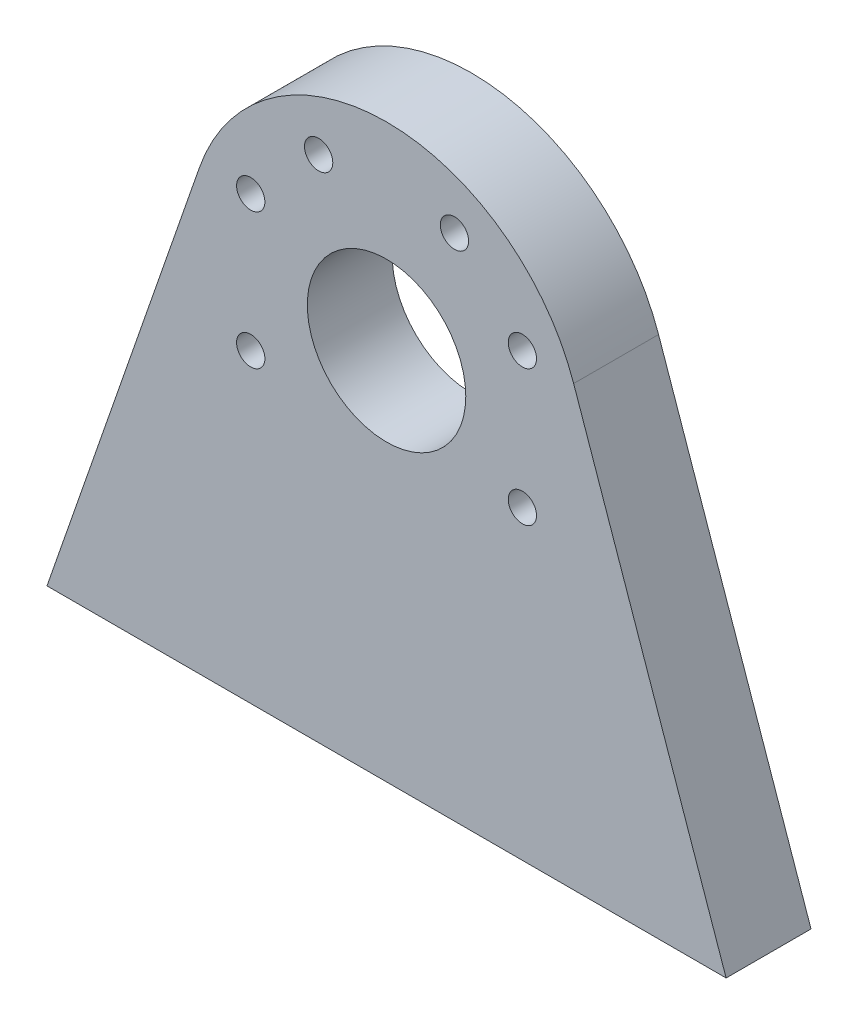
ISO-10303-21;
HEADER;
FILE_DESCRIPTION(('STEP AP214'),'2;1');
FILE_NAME('part.step','',(''),(''),'','','');
FILE_SCHEMA(('AUTOMOTIVE_DESIGN { 1 0 10303 214 1 1 1 1 }'));
ENDSEC;
DATA;
#1=APPLICATION_CONTEXT('core data for automotive mechanical design processes');
#2=APPLICATION_PROTOCOL_DEFINITION('international standard','automotive_design',2000,#1);
#3=PRODUCT_CONTEXT('',#1,'mechanical');
#4=PRODUCT('Part','Part','',(#3));
#5=PRODUCT_RELATED_PRODUCT_CATEGORY('part','',(#4));
#6=PRODUCT_DEFINITION_FORMATION('','',#4);
#7=PRODUCT_DEFINITION_CONTEXT('part definition',#1,'design');
#8=PRODUCT_DEFINITION('design','',#6,#7);
#9=PRODUCT_DEFINITION_SHAPE('','',#8);
#10=(LENGTH_UNIT() NAMED_UNIT(*) SI_UNIT(.MILLI.,.METRE.));
#11=(NAMED_UNIT(*) PLANE_ANGLE_UNIT() SI_UNIT($,.RADIAN.));
#12=(NAMED_UNIT(*) SI_UNIT($,.STERADIAN.) SOLID_ANGLE_UNIT());
#13=UNCERTAINTY_MEASURE_WITH_UNIT(LENGTH_MEASURE(1.E-05),#10,'distance_accuracy_value','');
#14=(GEOMETRIC_REPRESENTATION_CONTEXT(3) GLOBAL_UNCERTAINTY_ASSIGNED_CONTEXT((#13)) GLOBAL_UNIT_ASSIGNED_CONTEXT((#10,
#11,#12)) REPRESENTATION_CONTEXT('',''));
#15=CARTESIAN_POINT('',(0.,0.,0.));
#16=DIRECTION('',(0.,0.,1.));
#17=DIRECTION('',(1.,0.,0.));
#18=AXIS2_PLACEMENT_3D('',#15,#16,#17);
#19=CARTESIAN_POINT('',(0.,-33.,-7.5));
#20=DIRECTION('',(0.,1.,0.));
#21=DIRECTION('',(-1.,0.,0.));
#22=AXIS2_PLACEMENT_3D('',#19,#20,#21);
#23=PLANE('',#22);
#24=CARTESIAN_POINT('',(-18.,-33.,-3.75));
#25=DIRECTION('',(0.,1.,0.));
#26=DIRECTION('',(-1.,0.,0.));
#27=AXIS2_PLACEMENT_3D('',#24,#25,#26);
#28=CIRCLE('',#27,1.49999999999998);
#29=CARTESIAN_POINT('',(-19.5,-33.,-3.75));
#30=VERTEX_POINT('',#29);
#31=EDGE_CURVE('E176',#30,#30,#28,.T.);
#32=ORIENTED_EDGE('',*,*,#31,.T.);
#33=EDGE_LOOP('',(#32));
#34=FACE_BOUND('',#33,.T.);
#35=CARTESIAN_POINT('',(-5.99999999999999,-33.,-3.75));
#36=DIRECTION('',(0.,1.,0.));
#37=DIRECTION('',(-1.,0.,0.));
#38=AXIS2_PLACEMENT_3D('',#35,#36,#37);
#39=CIRCLE('',#38,1.50000000000001);
#40=CARTESIAN_POINT('',(-7.5,-33.,-3.75));
#41=VERTEX_POINT('',#40);
#42=EDGE_CURVE('E173',#41,#41,#39,.T.);
#43=ORIENTED_EDGE('',*,*,#42,.T.);
#44=EDGE_LOOP('',(#43));
#45=FACE_BOUND('',#44,.T.);
#46=CARTESIAN_POINT('',(6.00000000000001,-33.,-3.75));
#47=DIRECTION('',(0.,1.,0.));
#48=DIRECTION('',(-1.,0.,0.));
#49=AXIS2_PLACEMENT_3D('',#46,#47,#48);
#50=CIRCLE('',#49,1.50000000000001);
#51=CARTESIAN_POINT('',(4.5,-33.,-3.75));
#52=VERTEX_POINT('',#51);
#53=EDGE_CURVE('E170',#52,#52,#50,.T.);
#54=ORIENTED_EDGE('',*,*,#53,.T.);
#55=EDGE_LOOP('',(#54));
#56=FACE_BOUND('',#55,.T.);
#57=CARTESIAN_POINT('',(18.,-33.,-3.75));
#58=DIRECTION('',(0.,1.,0.));
#59=DIRECTION('',(-1.,0.,0.));
#60=AXIS2_PLACEMENT_3D('',#57,#58,#59);
#61=CIRCLE('',#60,1.50000000000001);
#62=CARTESIAN_POINT('',(16.5,-33.,-3.75));
#63=VERTEX_POINT('',#62);
#64=EDGE_CURVE('E167',#63,#63,#61,.T.);
#65=ORIENTED_EDGE('',*,*,#64,.T.);
#66=EDGE_LOOP('',(#65));
#67=FACE_BOUND('',#66,.T.);
#68=DIRECTION('',(-1.,0.,0.));
#69=VECTOR('',#68,1.);
#70=CARTESIAN_POINT('',(0.,-33.,0.));
#71=LINE('',#70,#69);
#72=CARTESIAN_POINT('',(30.,-33.,0.));
#73=VERTEX_POINT('',#72);
#74=CARTESIAN_POINT('',(-30.,-33.,0.));
#75=VERTEX_POINT('',#74);
#76=EDGE_CURVE('E132',#73,#75,#71,.T.);
#77=ORIENTED_EDGE('',*,*,#76,.T.);
#78=DIRECTION('',(0.,0.,1.));
#79=VECTOR('',#78,1.);
#80=CARTESIAN_POINT('',(-30.,-33.,-7.5));
#81=LINE('',#80,#79);
#82=CARTESIAN_POINT('',(-30.,-33.,-7.5));
#83=VERTEX_POINT('',#82);
#84=EDGE_CURVE('E160',#83,#75,#81,.T.);
#85=ORIENTED_EDGE('',*,*,#84,.F.);
#86=DIRECTION('',(-1.,0.,0.));
#87=VECTOR('',#86,1.);
#88=CARTESIAN_POINT('',(0.,-33.,-7.5));
#89=LINE('',#88,#87);
#90=CARTESIAN_POINT('',(30.,-33.,-7.5));
#91=VERTEX_POINT('',#90);
#92=EDGE_CURVE('E104',#91,#83,#89,.T.);
#93=ORIENTED_EDGE('',*,*,#92,.F.);
#94=DIRECTION('',(0.,0.,1.));
#95=VECTOR('',#94,1.);
#96=CARTESIAN_POINT('',(30.,-33.,-7.5));
#97=LINE('',#96,#95);
#98=EDGE_CURVE('E87',#91,#73,#97,.T.);
#99=ORIENTED_EDGE('',*,*,#98,.T.);
#100=EDGE_LOOP('',(#77,#85,#93,#99));
#101=FACE_BOUND('',#100,.T.);
#102=ADVANCED_FACE('F40',(#34,#45,#56,#67,#101),#23,.F.);
#103=CARTESIAN_POINT('',(-16.5295733982623,5.74658187720819,-7.5));
#104=DIRECTION('',(0.944547051329277,-0.32837610726904,0.));
#105=DIRECTION('',(0.32837610726904,0.944547051329277,0.));
#106=AXIS2_PLACEMENT_3D('',#103,#104,#105);
#107=PLANE('',#106);
#108=DIRECTION('',(0.32837610726904,0.944547051329277,0.));
#109=VECTOR('',#108,1.);
#110=CARTESIAN_POINT('',(-16.5295733982623,5.74658187720819,0.));
#111=LINE('',#110,#109);
#112=CARTESIAN_POINT('',(-16.5295733982623,5.74658187720819,0.));
#113=VERTEX_POINT('',#112);
#114=EDGE_CURVE('E81',#75,#113,#111,.T.);
#115=ORIENTED_EDGE('',*,*,#114,.T.);
#116=DIRECTION('',(0.,0.,1.));
#117=VECTOR('',#116,1.);
#118=CARTESIAN_POINT('',(-16.5295733982623,5.74658187720819,-7.5));
#119=LINE('',#118,#117);
#120=CARTESIAN_POINT('',(-16.5295733982623,5.74658187720819,-7.5));
#121=VERTEX_POINT('',#120);
#122=EDGE_CURVE('E74',#121,#113,#119,.T.);
#123=ORIENTED_EDGE('',*,*,#122,.F.);
#124=DIRECTION('',(0.32837610726904,0.944547051329277,0.));
#125=VECTOR('',#124,1.);
#126=CARTESIAN_POINT('',(-16.5295733982623,5.74658187720819,-7.5));
#127=LINE('',#126,#125);
#128=EDGE_CURVE('E58',#83,#121,#127,.T.);
#129=ORIENTED_EDGE('',*,*,#128,.F.);
#130=ORIENTED_EDGE('',*,*,#84,.T.);
#131=EDGE_LOOP('',(#115,#123,#129,#130));
#132=FACE_BOUND('',#131,.T.);
#133=ADVANCED_FACE('F202',(#132),#107,.F.);
#134=CARTESIAN_POINT('',(0.,0.,-7.5));
#135=DIRECTION('',(0.,0.,1.));
#136=DIRECTION('',(1.,0.,0.));
#137=AXIS2_PLACEMENT_3D('',#134,#135,#136);
#138=CYLINDRICAL_SURFACE('',#137,17.5);
#139=CARTESIAN_POINT('',(0.,0.,0.));
#140=DIRECTION('',(0.,0.,1.));
#141=DIRECTION('',(1.,0.,0.));
#142=AXIS2_PLACEMENT_3D('',#139,#140,#141);
#143=CIRCLE('',#142,17.5);
#144=CARTESIAN_POINT('',(16.5295733982623,5.7465818772082,0.));
#145=VERTEX_POINT('',#144);
#146=EDGE_CURVE('E94',#145,#113,#143,.T.);
#147=ORIENTED_EDGE('',*,*,#146,.F.);
#148=DIRECTION('',(0.,0.,1.));
#149=VECTOR('',#148,1.);
#150=CARTESIAN_POINT('',(16.5295733982623,5.7465818772082,-7.5));
#151=LINE('',#150,#149);
#152=CARTESIAN_POINT('',(16.5295733982623,5.7465818772082,-7.5));
#153=VERTEX_POINT('',#152);
#154=EDGE_CURVE('E90',#153,#145,#151,.T.);
#155=ORIENTED_EDGE('',*,*,#154,.F.);
#156=CARTESIAN_POINT('',(0.,0.,-7.5));
#157=DIRECTION('',(0.,0.,1.));
#158=DIRECTION('',(1.,0.,0.));
#159=AXIS2_PLACEMENT_3D('',#156,#157,#158);
#160=CIRCLE('',#159,17.5);
#161=EDGE_CURVE('E93',#153,#121,#160,.T.);
#162=ORIENTED_EDGE('',*,*,#161,.T.);
#163=ORIENTED_EDGE('',*,*,#122,.T.);
#164=EDGE_LOOP('',(#147,#155,#162,#163));
#165=FACE_BOUND('',#164,.T.);
#166=ADVANCED_FACE('F92',(#165),#138,.T.);
#167=CARTESIAN_POINT('',(12.,6.,-7.5));
#168=DIRECTION('',(0.,0.,1.));
#169=DIRECTION('',(1.,0.,0.));
#170=AXIS2_PLACEMENT_3D('',#167,#168,#169);
#171=CYLINDRICAL_SURFACE('',#170,1.25);
#172=CARTESIAN_POINT('',(12.,6.,-7.5));
#173=DIRECTION('',(0.,0.,1.));
#174=DIRECTION('',(1.,0.,0.));
#175=AXIS2_PLACEMENT_3D('',#172,#173,#174);
#176=CIRCLE('',#175,1.25);
#177=CARTESIAN_POINT('',(13.25,6.,-7.5));
#178=VERTEX_POINT('',#177);
#179=EDGE_CURVE('E126',#178,#178,#176,.T.);
#180=ORIENTED_EDGE('',*,*,#179,.F.);
#181=EDGE_LOOP('',(#180));
#182=FACE_BOUND('',#181,.T.);
#183=CARTESIAN_POINT('',(12.,6.,0.));
#184=DIRECTION('',(0.,0.,1.));
#185=DIRECTION('',(1.,0.,0.));
#186=AXIS2_PLACEMENT_3D('',#183,#184,#185);
#187=CIRCLE('',#186,1.25);
#188=CARTESIAN_POINT('',(13.25,6.,0.));
#189=VERTEX_POINT('',#188);
#190=EDGE_CURVE('E155',#189,#189,#187,.T.);
#191=ORIENTED_EDGE('',*,*,#190,.T.);
#192=EDGE_LOOP('',(#191));
#193=FACE_BOUND('',#192,.T.);
#194=ADVANCED_FACE('F286',(#182,#193),#171,.F.);
#195=CARTESIAN_POINT('',(6.,12.,-7.5));
#196=DIRECTION('',(0.,0.,1.));
#197=DIRECTION('',(1.,0.,0.));
#198=AXIS2_PLACEMENT_3D('',#195,#196,#197);
#199=CYLINDRICAL_SURFACE('',#198,1.25);
#200=CARTESIAN_POINT('',(6.,12.,-7.5));
#201=DIRECTION('',(0.,0.,1.));
#202=DIRECTION('',(1.,0.,0.));
#203=AXIS2_PLACEMENT_3D('',#200,#201,#202);
#204=CIRCLE('',#203,1.25);
#205=CARTESIAN_POINT('',(7.25,12.,-7.5));
#206=VERTEX_POINT('',#205);
#207=EDGE_CURVE('E123',#206,#206,#204,.T.);
#208=ORIENTED_EDGE('',*,*,#207,.F.);
#209=EDGE_LOOP('',(#208));
#210=FACE_BOUND('',#209,.T.);
#211=CARTESIAN_POINT('',(6.,12.,0.));
#212=DIRECTION('',(0.,0.,1.));
#213=DIRECTION('',(1.,0.,0.));
#214=AXIS2_PLACEMENT_3D('',#211,#212,#213);
#215=CIRCLE('',#214,1.25);
#216=CARTESIAN_POINT('',(7.25,12.,0.));
#217=VERTEX_POINT('',#216);
#218=EDGE_CURVE('E152',#217,#217,#215,.T.);
#219=ORIENTED_EDGE('',*,*,#218,.T.);
#220=EDGE_LOOP('',(#219));
#221=FACE_BOUND('',#220,.T.);
#222=ADVANCED_FACE('F289',(#210,#221),#199,.F.);
#223=CARTESIAN_POINT('',(-12.,-6.,-7.5));
#224=DIRECTION('',(0.,0.,1.));
#225=DIRECTION('',(1.,0.,0.));
#226=AXIS2_PLACEMENT_3D('',#223,#224,#225);
#227=CYLINDRICAL_SURFACE('',#226,1.25);
#228=CARTESIAN_POINT('',(-12.,-6.,-7.5));
#229=DIRECTION('',(0.,0.,1.));
#230=DIRECTION('',(1.,0.,0.));
#231=AXIS2_PLACEMENT_3D('',#228,#229,#230);
#232=CIRCLE('',#231,1.25);
#233=CARTESIAN_POINT('',(-10.75,-6.,-7.5));
#234=VERTEX_POINT('',#233);
#235=EDGE_CURVE('E120',#234,#234,#232,.T.);
#236=ORIENTED_EDGE('',*,*,#235,.F.);
#237=EDGE_LOOP('',(#236));
#238=FACE_BOUND('',#237,.T.);
#239=CARTESIAN_POINT('',(-12.,-6.,0.));
#240=DIRECTION('',(0.,0.,1.));
#241=DIRECTION('',(1.,0.,0.));
#242=AXIS2_PLACEMENT_3D('',#239,#240,#241);
#243=CIRCLE('',#242,1.25);
#244=CARTESIAN_POINT('',(-10.75,-6.,0.));
#245=VERTEX_POINT('',#244);
#246=EDGE_CURVE('E149',#245,#245,#243,.T.);
#247=ORIENTED_EDGE('',*,*,#246,.T.);
#248=EDGE_LOOP('',(#247));
#249=FACE_BOUND('',#248,.T.);
#250=ADVANCED_FACE('F293',(#238,#249),#227,.F.);
#251=CARTESIAN_POINT('',(-12.,6.,-7.5));
#252=DIRECTION('',(0.,0.,1.));
#253=DIRECTION('',(1.,0.,0.));
#254=AXIS2_PLACEMENT_3D('',#251,#252,#253);
#255=CYLINDRICAL_SURFACE('',#254,1.25);
#256=CARTESIAN_POINT('',(-12.,6.,-7.5));
#257=DIRECTION('',(0.,0.,1.));
#258=DIRECTION('',(1.,0.,0.));
#259=AXIS2_PLACEMENT_3D('',#256,#257,#258);
#260=CIRCLE('',#259,1.25);
#261=CARTESIAN_POINT('',(-10.75,6.,-7.5));
#262=VERTEX_POINT('',#261);
#263=EDGE_CURVE('E117',#262,#262,#260,.T.);
#264=ORIENTED_EDGE('',*,*,#263,.F.);
#265=EDGE_LOOP('',(#264));
#266=FACE_BOUND('',#265,.T.);
#267=CARTESIAN_POINT('',(-12.,6.,0.));
#268=DIRECTION('',(0.,0.,1.));
#269=DIRECTION('',(1.,0.,0.));
#270=AXIS2_PLACEMENT_3D('',#267,#268,#269);
#271=CIRCLE('',#270,1.25);
#272=CARTESIAN_POINT('',(-10.75,6.,0.));
#273=VERTEX_POINT('',#272);
#274=EDGE_CURVE('E146',#273,#273,#271,.T.);
#275=ORIENTED_EDGE('',*,*,#274,.T.);
#276=EDGE_LOOP('',(#275));
#277=FACE_BOUND('',#276,.T.);
#278=ADVANCED_FACE('F297',(#266,#277),#255,.F.);
#279=CARTESIAN_POINT('',(-6.,12.,-7.5));
#280=DIRECTION('',(0.,0.,1.));
#281=DIRECTION('',(1.,0.,0.));
#282=AXIS2_PLACEMENT_3D('',#279,#280,#281);
#283=CYLINDRICAL_SURFACE('',#282,1.25);
#284=CARTESIAN_POINT('',(-6.,12.,-7.5));
#285=DIRECTION('',(0.,0.,1.));
#286=DIRECTION('',(1.,0.,0.));
#287=AXIS2_PLACEMENT_3D('',#284,#285,#286);
#288=CIRCLE('',#287,1.25);
#289=CARTESIAN_POINT('',(-4.75,12.,-7.5));
#290=VERTEX_POINT('',#289);
#291=EDGE_CURVE('E114',#290,#290,#288,.T.);
#292=ORIENTED_EDGE('',*,*,#291,.F.);
#293=EDGE_LOOP('',(#292));
#294=FACE_BOUND('',#293,.T.);
#295=CARTESIAN_POINT('',(-6.,12.,0.));
#296=DIRECTION('',(0.,0.,1.));
#297=DIRECTION('',(1.,0.,0.));
#298=AXIS2_PLACEMENT_3D('',#295,#296,#297);
#299=CIRCLE('',#298,1.25);
#300=CARTESIAN_POINT('',(-4.75,12.,0.));
#301=VERTEX_POINT('',#300);
#302=EDGE_CURVE('E143',#301,#301,#299,.T.);
#303=ORIENTED_EDGE('',*,*,#302,.T.);
#304=EDGE_LOOP('',(#303));
#305=FACE_BOUND('',#304,.T.);
#306=ADVANCED_FACE('F301',(#294,#305),#283,.F.);
#307=CARTESIAN_POINT('',(0.,0.,-7.5));
#308=DIRECTION('',(0.,0.,1.));
#309=DIRECTION('',(1.,0.,0.));
#310=AXIS2_PLACEMENT_3D('',#307,#308,#309);
#311=CYLINDRICAL_SURFACE('',#310,7.);
#312=CARTESIAN_POINT('',(0.,0.,-7.5));
#313=DIRECTION('',(0.,0.,1.));
#314=DIRECTION('',(1.,0.,0.));
#315=AXIS2_PLACEMENT_3D('',#312,#313,#314);
#316=CIRCLE('',#315,7.);
#317=CARTESIAN_POINT('',(7.,0.,-7.5));
#318=VERTEX_POINT('',#317);
#319=EDGE_CURVE('E111',#318,#318,#316,.T.);
#320=ORIENTED_EDGE('',*,*,#319,.F.);
#321=EDGE_LOOP('',(#320));
#322=FACE_BOUND('',#321,.T.);
#323=CARTESIAN_POINT('',(0.,0.,0.));
#324=DIRECTION('',(0.,0.,1.));
#325=DIRECTION('',(1.,0.,0.));
#326=AXIS2_PLACEMENT_3D('',#323,#324,#325);
#327=CIRCLE('',#326,7.);
#328=CARTESIAN_POINT('',(7.,0.,0.));
#329=VERTEX_POINT('',#328);
#330=EDGE_CURVE('E140',#329,#329,#327,.T.);
#331=ORIENTED_EDGE('',*,*,#330,.T.);
#332=EDGE_LOOP('',(#331));
#333=FACE_BOUND('',#332,.T.);
#334=ADVANCED_FACE('F305',(#322,#333),#311,.F.);
#335=CARTESIAN_POINT('',(16.5295733982623,5.7465818772082,-7.5));
#336=DIRECTION('',(0.944547051329277,0.32837610726904,0.));
#337=DIRECTION('',(-0.32837610726904,0.944547051329277,0.));
#338=AXIS2_PLACEMENT_3D('',#335,#336,#337);
#339=PLANE('',#338);
#340=DIRECTION('',(-0.32837610726904,0.944547051329277,0.));
#341=VECTOR('',#340,1.);
#342=CARTESIAN_POINT('',(16.5295733982623,5.7465818772082,0.));
#343=LINE('',#342,#341);
#344=EDGE_CURVE('E135',#73,#145,#343,.T.);
#345=ORIENTED_EDGE('',*,*,#344,.F.);
#346=ORIENTED_EDGE('',*,*,#98,.F.);
#347=DIRECTION('',(-0.32837610726904,0.944547051329277,0.));
#348=VECTOR('',#347,1.);
#349=CARTESIAN_POINT('',(16.5295733982623,5.7465818772082,-7.5));
#350=LINE('',#349,#348);
#351=EDGE_CURVE('E101',#91,#153,#350,.T.);
#352=ORIENTED_EDGE('',*,*,#351,.T.);
#353=ORIENTED_EDGE('',*,*,#154,.T.);
#354=EDGE_LOOP('',(#345,#346,#352,#353));
#355=FACE_BOUND('',#354,.T.);
#356=ADVANCED_FACE('F103',(#355),#339,.T.);
#357=CARTESIAN_POINT('',(12.,-6.,-7.5));
#358=DIRECTION('',(0.,0.,1.));
#359=DIRECTION('',(1.,0.,0.));
#360=AXIS2_PLACEMENT_3D('',#357,#358,#359);
#361=CYLINDRICAL_SURFACE('',#360,1.25);
#362=CARTESIAN_POINT('',(12.,-6.,-7.5));
#363=DIRECTION('',(0.,0.,1.));
#364=DIRECTION('',(1.,0.,0.));
#365=AXIS2_PLACEMENT_3D('',#362,#363,#364);
#366=CIRCLE('',#365,1.25);
#367=CARTESIAN_POINT('',(13.25,-6.,-7.5));
#368=VERTEX_POINT('',#367);
#369=EDGE_CURVE('E129',#368,#368,#366,.T.);
#370=ORIENTED_EDGE('',*,*,#369,.F.);
#371=EDGE_LOOP('',(#370));
#372=FACE_BOUND('',#371,.T.);
#373=CARTESIAN_POINT('',(12.,-6.,0.));
#374=DIRECTION('',(0.,0.,1.));
#375=DIRECTION('',(1.,0.,0.));
#376=AXIS2_PLACEMENT_3D('',#373,#374,#375);
#377=CIRCLE('',#376,1.25);
#378=CARTESIAN_POINT('',(13.25,-6.,0.));
#379=VERTEX_POINT('',#378);
#380=EDGE_CURVE('E106',#379,#379,#377,.T.);
#381=ORIENTED_EDGE('',*,*,#380,.T.);
#382=EDGE_LOOP('',(#381));
#383=FACE_BOUND('',#382,.T.);
#384=ADVANCED_FACE('F280',(#372,#383),#361,.F.);
#385=CARTESIAN_POINT('',(0.,0.,-7.5));
#386=DIRECTION('',(0.,0.,1.));
#387=DIRECTION('',(1.,0.,0.));
#388=AXIS2_PLACEMENT_3D('',#385,#386,#387);
#389=PLANE('',#388);
#390=ORIENTED_EDGE('',*,*,#92,.T.);
#391=ORIENTED_EDGE('',*,*,#128,.T.);
#392=ORIENTED_EDGE('',*,*,#161,.F.);
#393=ORIENTED_EDGE('',*,*,#351,.F.);
#394=EDGE_LOOP('',(#390,#391,#392,#393));
#395=FACE_BOUND('',#394,.T.);
#396=ORIENTED_EDGE('',*,*,#319,.T.);
#397=EDGE_LOOP('',(#396));
#398=FACE_BOUND('',#397,.T.);
#399=ORIENTED_EDGE('',*,*,#291,.T.);
#400=EDGE_LOOP('',(#399));
#401=FACE_BOUND('',#400,.T.);
#402=ORIENTED_EDGE('',*,*,#263,.T.);
#403=EDGE_LOOP('',(#402));
#404=FACE_BOUND('',#403,.T.);
#405=ORIENTED_EDGE('',*,*,#235,.T.);
#406=EDGE_LOOP('',(#405));
#407=FACE_BOUND('',#406,.T.);
#408=ORIENTED_EDGE('',*,*,#207,.T.);
#409=EDGE_LOOP('',(#408));
#410=FACE_BOUND('',#409,.T.);
#411=ORIENTED_EDGE('',*,*,#179,.T.);
#412=EDGE_LOOP('',(#411));
#413=FACE_BOUND('',#412,.T.);
#414=ORIENTED_EDGE('',*,*,#369,.T.);
#415=EDGE_LOOP('',(#414));
#416=FACE_BOUND('',#415,.T.);
#417=ADVANCED_FACE('F99',(#395,#398,#401,#404,#407,#410,#413,#416),#389,.F.);
#418=CARTESIAN_POINT('',(0.,0.,0.));
#419=DIRECTION('',(0.,0.,1.));
#420=DIRECTION('',(1.,0.,0.));
#421=AXIS2_PLACEMENT_3D('',#418,#419,#420);
#422=PLANE('',#421);
#423=ORIENTED_EDGE('',*,*,#76,.F.);
#424=ORIENTED_EDGE('',*,*,#344,.T.);
#425=ORIENTED_EDGE('',*,*,#146,.T.);
#426=ORIENTED_EDGE('',*,*,#114,.F.);
#427=EDGE_LOOP('',(#423,#424,#425,#426));
#428=FACE_BOUND('',#427,.T.);
#429=ORIENTED_EDGE('',*,*,#330,.F.);
#430=EDGE_LOOP('',(#429));
#431=FACE_BOUND('',#430,.T.);
#432=ORIENTED_EDGE('',*,*,#302,.F.);
#433=EDGE_LOOP('',(#432));
#434=FACE_BOUND('',#433,.T.);
#435=ORIENTED_EDGE('',*,*,#274,.F.);
#436=EDGE_LOOP('',(#435));
#437=FACE_BOUND('',#436,.T.);
#438=ORIENTED_EDGE('',*,*,#246,.F.);
#439=EDGE_LOOP('',(#438));
#440=FACE_BOUND('',#439,.T.);
#441=ORIENTED_EDGE('',*,*,#218,.F.);
#442=EDGE_LOOP('',(#441));
#443=FACE_BOUND('',#442,.T.);
#444=ORIENTED_EDGE('',*,*,#190,.F.);
#445=EDGE_LOOP('',(#444));
#446=FACE_BOUND('',#445,.T.);
#447=ORIENTED_EDGE('',*,*,#380,.F.);
#448=EDGE_LOOP('',(#447));
#449=FACE_BOUND('',#448,.T.);
#450=ADVANCED_FACE('F240',(#428,#431,#434,#437,#440,#443,#446,#449),#422,.T.);
#451=CARTESIAN_POINT('',(-18.,-25.5,-3.75));
#452=DIRECTION('',(0.,-1.,0.));
#453=DIRECTION('',(1.,0.,0.));
#454=AXIS2_PLACEMENT_3D('',#451,#452,#453);
#455=CYLINDRICAL_SURFACE('',#454,1.3);
#456=CARTESIAN_POINT('',(-18.,-32.8,-3.75));
#457=DIRECTION('',(0.,1.,0.));
#458=DIRECTION('',(0.,0.,1.));
#459=AXIS2_PLACEMENT_3D('',#456,#457,#458);
#460=CIRCLE('',#459,1.3);
#461=CARTESIAN_POINT('',(-18.,-32.8,-2.45));
#462=VERTEX_POINT('',#461);
#463=EDGE_CURVE('E162',#462,#462,#460,.F.);
#464=ORIENTED_EDGE('',*,*,#463,.T.);
#465=EDGE_LOOP('',(#464));
#466=FACE_BOUND('',#465,.T.);
#467=CARTESIAN_POINT('',(-18.,-25.5,-3.75));
#468=DIRECTION('',(0.,-1.,0.));
#469=DIRECTION('',(1.,0.,0.));
#470=AXIS2_PLACEMENT_3D('',#467,#468,#469);
#471=CIRCLE('',#470,1.3);
#472=CARTESIAN_POINT('',(-16.7,-25.5,-3.75));
#473=VERTEX_POINT('',#472);
#474=EDGE_CURVE('E244',#473,#473,#471,.T.);
#475=ORIENTED_EDGE('',*,*,#474,.F.);
#476=EDGE_LOOP('',(#475));
#477=FACE_BOUND('',#476,.T.);
#478=ADVANCED_FACE('F236',(#466,#477),#455,.F.);
#479=CARTESIAN_POINT('',(-18.,-25.5,-3.75));
#480=DIRECTION('',(0.,-1.,0.));
#481=DIRECTION('',(1.,0.,0.));
#482=AXIS2_PLACEMENT_3D('',#479,#480,#481);
#483=PLANE('',#482);
#484=ORIENTED_EDGE('',*,*,#474,.T.);
#485=EDGE_LOOP('',(#484));
#486=FACE_BOUND('',#485,.T.);
#487=ADVANCED_FACE('F239',(#486),#483,.T.);
#488=CARTESIAN_POINT('',(-5.99999999999999,-25.5,-3.75));
#489=DIRECTION('',(0.,-1.,0.));
#490=DIRECTION('',(1.,0.,0.));
#491=AXIS2_PLACEMENT_3D('',#488,#489,#490);
#492=CYLINDRICAL_SURFACE('',#491,1.3);
#493=CARTESIAN_POINT('',(-5.99999999999999,-32.8,-3.75));
#494=DIRECTION('',(0.,1.,0.));
#495=DIRECTION('',(0.,0.,1.));
#496=AXIS2_PLACEMENT_3D('',#493,#494,#495);
#497=CIRCLE('',#496,1.3);
#498=CARTESIAN_POINT('',(-5.99999999999999,-32.8,-2.45));
#499=VERTEX_POINT('',#498);
#500=EDGE_CURVE('E179',#499,#499,#497,.F.);
#501=ORIENTED_EDGE('',*,*,#500,.T.);
#502=EDGE_LOOP('',(#501));
#503=FACE_BOUND('',#502,.T.);
#504=CARTESIAN_POINT('',(-5.99999999999999,-25.5,-3.75));
#505=DIRECTION('',(0.,-1.,0.));
#506=DIRECTION('',(1.,0.,0.));
#507=AXIS2_PLACEMENT_3D('',#504,#505,#506);
#508=CIRCLE('',#507,1.3);
#509=CARTESIAN_POINT('',(-4.69999999999999,-25.5,-3.75));
#510=VERTEX_POINT('',#509);
#511=EDGE_CURVE('E246',#510,#510,#508,.T.);
#512=ORIENTED_EDGE('',*,*,#511,.F.);
#513=EDGE_LOOP('',(#512));
#514=FACE_BOUND('',#513,.T.);
#515=ADVANCED_FACE('F269',(#503,#514),#492,.F.);
#516=CARTESIAN_POINT('',(-5.99999999999999,-25.5,-3.75));
#517=DIRECTION('',(0.,-1.,0.));
#518=DIRECTION('',(1.,0.,0.));
#519=AXIS2_PLACEMENT_3D('',#516,#517,#518);
#520=PLANE('',#519);
#521=ORIENTED_EDGE('',*,*,#511,.T.);
#522=EDGE_LOOP('',(#521));
#523=FACE_BOUND('',#522,.T.);
#524=ADVANCED_FACE('F267',(#523),#520,.T.);
#525=CARTESIAN_POINT('',(6.00000000000001,-25.5,-3.75));
#526=DIRECTION('',(0.,-1.,0.));
#527=DIRECTION('',(1.,0.,0.));
#528=AXIS2_PLACEMENT_3D('',#525,#526,#527);
#529=CYLINDRICAL_SURFACE('',#528,1.3);
#530=CARTESIAN_POINT('',(6.00000000000001,-32.8,-3.75));
#531=DIRECTION('',(0.,1.,0.));
#532=DIRECTION('',(0.,0.,1.));
#533=AXIS2_PLACEMENT_3D('',#530,#531,#532);
#534=CIRCLE('',#533,1.3);
#535=CARTESIAN_POINT('',(6.00000000000001,-32.8,-2.45));
#536=VERTEX_POINT('',#535);
#537=EDGE_CURVE('E50',#536,#536,#534,.F.);
#538=ORIENTED_EDGE('',*,*,#537,.T.);
#539=EDGE_LOOP('',(#538));
#540=FACE_BOUND('',#539,.T.);
#541=CARTESIAN_POINT('',(6.00000000000001,-25.5,-3.75));
#542=DIRECTION('',(0.,-1.,0.));
#543=DIRECTION('',(1.,0.,0.));
#544=AXIS2_PLACEMENT_3D('',#541,#542,#543);
#545=CIRCLE('',#544,1.3);
#546=CARTESIAN_POINT('',(7.30000000000001,-25.5,-3.75));
#547=VERTEX_POINT('',#546);
#548=EDGE_CURVE('E248',#547,#547,#545,.T.);
#549=ORIENTED_EDGE('',*,*,#548,.F.);
#550=EDGE_LOOP('',(#549));
#551=FACE_BOUND('',#550,.T.);
#552=ADVANCED_FACE('F184',(#540,#551),#529,.F.);
#553=CARTESIAN_POINT('',(6.00000000000001,-25.5,-3.75));
#554=DIRECTION('',(0.,-1.,0.));
#555=DIRECTION('',(1.,0.,0.));
#556=AXIS2_PLACEMENT_3D('',#553,#554,#555);
#557=PLANE('',#556);
#558=ORIENTED_EDGE('',*,*,#548,.T.);
#559=EDGE_LOOP('',(#558));
#560=FACE_BOUND('',#559,.T.);
#561=ADVANCED_FACE('F257',(#560),#557,.T.);
#562=CARTESIAN_POINT('',(18.,-25.5,-3.75));
#563=DIRECTION('',(0.,-1.,0.));
#564=DIRECTION('',(1.,0.,0.));
#565=AXIS2_PLACEMENT_3D('',#562,#563,#564);
#566=CYLINDRICAL_SURFACE('',#565,1.3);
#567=CARTESIAN_POINT('',(18.,-32.8,-3.75));
#568=DIRECTION('',(0.,1.,0.));
#569=DIRECTION('',(0.,0.,1.));
#570=AXIS2_PLACEMENT_3D('',#567,#568,#569);
#571=CIRCLE('',#570,1.3);
#572=CARTESIAN_POINT('',(18.,-32.8,-2.45));
#573=VERTEX_POINT('',#572);
#574=EDGE_CURVE('E11',#573,#573,#571,.F.);
#575=ORIENTED_EDGE('',*,*,#574,.T.);
#576=EDGE_LOOP('',(#575));
#577=FACE_BOUND('',#576,.T.);
#578=CARTESIAN_POINT('',(18.,-25.5,-3.75));
#579=DIRECTION('',(0.,-1.,0.));
#580=DIRECTION('',(1.,0.,0.));
#581=AXIS2_PLACEMENT_3D('',#578,#579,#580);
#582=CIRCLE('',#581,1.3);
#583=CARTESIAN_POINT('',(19.3,-25.5,-3.75));
#584=VERTEX_POINT('',#583);
#585=EDGE_CURVE('E136',#584,#584,#582,.T.);
#586=ORIENTED_EDGE('',*,*,#585,.F.);
#587=EDGE_LOOP('',(#586));
#588=FACE_BOUND('',#587,.T.);
#589=ADVANCED_FACE('F229',(#577,#588),#566,.F.);
#590=CARTESIAN_POINT('',(0.,-25.5,0.));
#591=DIRECTION('',(0.,-1.,0.));
#592=DIRECTION('',(1.,0.,0.));
#593=AXIS2_PLACEMENT_3D('',#590,#591,#592);
#594=PLANE('',#593);
#595=ORIENTED_EDGE('',*,*,#585,.T.);
#596=EDGE_LOOP('',(#595));
#597=FACE_BOUND('',#596,.T.);
#598=ADVANCED_FACE('F218',(#597),#594,.T.);
#599=CARTESIAN_POINT('',(-18.,-32.8,-3.75));
#600=DIRECTION('',(0.,-1.,0.));
#601=DIRECTION('',(0.,0.,-1.));
#602=AXIS2_PLACEMENT_3D('',#599,#600,#601);
#603=CONICAL_SURFACE('',#602,1.3,0.785398163397439);
#604=ORIENTED_EDGE('',*,*,#31,.F.);
#605=EDGE_LOOP('',(#604));
#606=FACE_BOUND('',#605,.T.);
#607=ORIENTED_EDGE('',*,*,#463,.F.);
#608=EDGE_LOOP('',(#607));
#609=FACE_BOUND('',#608,.T.);
#610=ADVANCED_FACE('F196',(#606,#609),#603,.F.);
#611=CARTESIAN_POINT('',(-5.99999999999999,-32.8,-3.75));
#612=DIRECTION('',(0.,-1.,0.));
#613=DIRECTION('',(0.,0.,-1.));
#614=AXIS2_PLACEMENT_3D('',#611,#612,#613);
#615=CONICAL_SURFACE('',#614,1.3,0.785398163397458);
#616=ORIENTED_EDGE('',*,*,#42,.F.);
#617=EDGE_LOOP('',(#616));
#618=FACE_BOUND('',#617,.T.);
#619=ORIENTED_EDGE('',*,*,#500,.F.);
#620=EDGE_LOOP('',(#619));
#621=FACE_BOUND('',#620,.T.);
#622=ADVANCED_FACE('F189',(#618,#621),#615,.F.);
#623=CARTESIAN_POINT('',(6.00000000000001,-32.8,-3.75));
#624=DIRECTION('',(0.,-1.,0.));
#625=DIRECTION('',(0.,0.,-1.));
#626=AXIS2_PLACEMENT_3D('',#623,#624,#625);
#627=CONICAL_SURFACE('',#626,1.3,0.785398163397458);
#628=ORIENTED_EDGE('',*,*,#53,.F.);
#629=EDGE_LOOP('',(#628));
#630=FACE_BOUND('',#629,.T.);
#631=ORIENTED_EDGE('',*,*,#537,.F.);
#632=EDGE_LOOP('',(#631));
#633=FACE_BOUND('',#632,.T.);
#634=ADVANCED_FACE('F187',(#630,#633),#627,.F.);
#635=CARTESIAN_POINT('',(18.,-32.8,-3.75));
#636=DIRECTION('',(0.,-1.,0.));
#637=DIRECTION('',(0.,0.,-1.));
#638=AXIS2_PLACEMENT_3D('',#635,#636,#637);
#639=CONICAL_SURFACE('',#638,1.3,0.785398163397439);
#640=ORIENTED_EDGE('',*,*,#64,.F.);
#641=EDGE_LOOP('',(#640));
#642=FACE_BOUND('',#641,.T.);
#643=ORIENTED_EDGE('',*,*,#574,.F.);
#644=EDGE_LOOP('',(#643));
#645=FACE_BOUND('',#644,.T.);
#646=ADVANCED_FACE('F43',(#642,#645),#639,.F.);
#647=CLOSED_SHELL('',(#102,#133,#166,#194,#222,#250,#278,#306,#334,#356,#384,#417,#450,#478,
#487,#515,#524,#552,#561,#589,#598,#610,#622,#634,#646));
#648=MANIFOLD_SOLID_BREP('B2',#647);
#649=ADVANCED_BREP_SHAPE_REPRESENTATION('',(#18,#648),#14);
#650=SHAPE_DEFINITION_REPRESENTATION(#9,#649);
ENDSEC;
END-ISO-10303-21;
